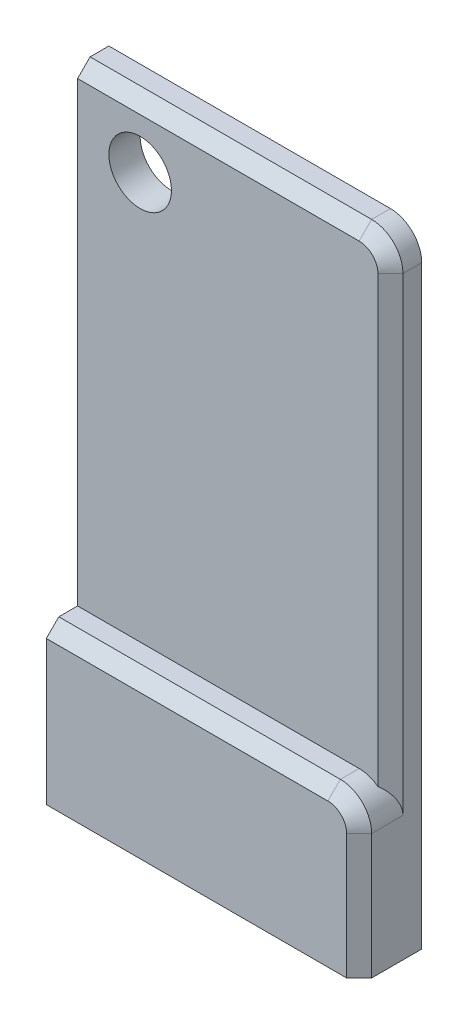
ISO-10303-21;
HEADER;
FILE_DESCRIPTION(('STEP AP214'),'2;1');
FILE_NAME('part.step','',(''),(''),'','','');
FILE_SCHEMA(('AUTOMOTIVE_DESIGN { 1 0 10303 214 1 1 1 1 }'));
ENDSEC;
DATA;
#1=APPLICATION_CONTEXT('core data for automotive mechanical design processes');
#2=APPLICATION_PROTOCOL_DEFINITION('international standard','automotive_design',2000,#1);
#3=PRODUCT_CONTEXT('',#1,'mechanical');
#4=PRODUCT('Part','Part','',(#3));
#5=PRODUCT_RELATED_PRODUCT_CATEGORY('part','',(#4));
#6=PRODUCT_DEFINITION_FORMATION('','',#4);
#7=PRODUCT_DEFINITION_CONTEXT('part definition',#1,'design');
#8=PRODUCT_DEFINITION('design','',#6,#7);
#9=PRODUCT_DEFINITION_SHAPE('','',#8);
#10=(LENGTH_UNIT() NAMED_UNIT(*) SI_UNIT(.MILLI.,.METRE.));
#11=(NAMED_UNIT(*) PLANE_ANGLE_UNIT() SI_UNIT($,.RADIAN.));
#12=(NAMED_UNIT(*) SI_UNIT($,.STERADIAN.) SOLID_ANGLE_UNIT());
#13=UNCERTAINTY_MEASURE_WITH_UNIT(LENGTH_MEASURE(1.E-05),#10,'distance_accuracy_value','');
#14=(GEOMETRIC_REPRESENTATION_CONTEXT(3) GLOBAL_UNCERTAINTY_ASSIGNED_CONTEXT((#13)) GLOBAL_UNIT_ASSIGNED_CONTEXT((#10,
#11,#12)) REPRESENTATION_CONTEXT('',''));
#15=CARTESIAN_POINT('',(0.,0.,0.));
#16=DIRECTION('',(0.,0.,1.));
#17=DIRECTION('',(1.,0.,0.));
#18=AXIS2_PLACEMENT_3D('',#15,#16,#17);
#19=CARTESIAN_POINT('',(0.,0.,0.));
#20=DIRECTION('',(0.,0.,1.));
#21=DIRECTION('',(1.,0.,0.));
#22=AXIS2_PLACEMENT_3D('',#19,#20,#21);
#23=PLANE('',#22);
#24=CARTESIAN_POINT('',(-100.000000000001,360.714285714286,0.));
#25=DIRECTION('',(0.,0.,1.));
#26=DIRECTION('',(1.,0.,0.));
#27=AXIS2_PLACEMENT_3D('',#24,#25,#26);
#28=CIRCLE('',#27,50.);
#29=CARTESIAN_POINT('',(-50.0000000000006,360.714285714286,0.));
#30=VERTEX_POINT('',#29);
#31=EDGE_CURVE('E336',#30,#30,#28,.T.);
#32=ORIENTED_EDGE('',*,*,#31,.T.);
#33=EDGE_LOOP('',(#32));
#34=FACE_BOUND('',#33,.T.);
#35=CARTESIAN_POINT('',(-100.000000000001,360.714285714286,0.));
#36=DIRECTION('',(0.,0.,1.));
#37=DIRECTION('',(1.,0.,0.));
#38=AXIS2_PLACEMENT_3D('',#35,#36,#37);
#39=CIRCLE('',#38,60.);
#40=CARTESIAN_POINT('',(-40.0000000000006,360.714285714286,0.));
#41=VERTEX_POINT('',#40);
#42=EDGE_CURVE('E249',#41,#41,#39,.T.);
#43=ORIENTED_EDGE('',*,*,#42,.F.);
#44=EDGE_LOOP('',(#43));
#45=FACE_BOUND('',#44,.T.);
#46=ADVANCED_FACE('F44',(#34,#45),#23,.F.);
#47=CARTESIAN_POINT('',(-200.000000000001,460.714285714286,50.));
#48=DIRECTION('',(1.,0.,0.));
#49=DIRECTION('',(0.,1.,0.));
#50=AXIS2_PLACEMENT_3D('',#47,#48,#49);
#51=PLANE('',#50);
#52=DIRECTION('',(0.,-0.707106781186546,0.707106781186549));
#53=VECTOR('',#52,1.);
#54=CARTESIAN_POINT('',(-200.000000000001,-316.35678209758,92.9289321881346));
#55=LINE('',#54,#53);
#56=CARTESIAN_POINT('',(-200.000000000001,-313.427849909445,90.));
#57=VERTEX_POINT('',#56);
#58=CARTESIAN_POINT('',(-200.000000000001,-299.285714285714,75.857864376269));
#59=VERTEX_POINT('',#58);
#60=EDGE_CURVE('E268',#57,#59,#55,.F.);
#61=ORIENTED_EDGE('',*,*,#60,.F.);
#62=DIRECTION('',(0.,-1.,0.));
#63=VECTOR('',#62,1.);
#64=CARTESIAN_POINT('',(-200.000000000001,0.,90.));
#65=LINE('',#64,#63);
#66=CARTESIAN_POINT('',(-200.000000000001,-539.285714285714,90.));
#67=VERTEX_POINT('',#66);
#68=EDGE_CURVE('E265',#57,#67,#65,.T.);
#69=ORIENTED_EDGE('',*,*,#68,.T.);
#70=DIRECTION('',(0.,0.,-1.));
#71=VECTOR('',#70,1.);
#72=CARTESIAN_POINT('',(-200.000000000001,-539.285714285714,50.));
#73=LINE('',#72,#71);
#74=CARTESIAN_POINT('',(-200.000000000001,-539.285714285714,100.));
#75=VERTEX_POINT('',#74);
#76=EDGE_CURVE('E385',#75,#67,#73,.T.);
#77=ORIENTED_EDGE('',*,*,#76,.F.);
#78=DIRECTION('',(0.,-1.,0.));
#79=VECTOR('',#78,1.);
#80=CARTESIAN_POINT('',(-200.000000000001,-539.285714285714,100.));
#81=LINE('',#80,#79);
#82=CARTESIAN_POINT('',(-200.000000000001,-309.285714285714,100.));
#83=VERTEX_POINT('',#82);
#84=EDGE_CURVE('E346',#83,#75,#81,.T.);
#85=ORIENTED_EDGE('',*,*,#84,.F.);
#86=DIRECTION('',(0.,-0.707106781186546,0.707106781186549));
#87=VECTOR('',#86,1.);
#88=CARTESIAN_POINT('',(-200.000000000001,-309.285714285714,100.));
#89=LINE('',#88,#87);
#90=CARTESIAN_POINT('',(-200.000000000001,-289.285714285714,80.));
#91=VERTEX_POINT('',#90);
#92=EDGE_CURVE('E436',#83,#91,#89,.F.);
#93=ORIENTED_EDGE('',*,*,#92,.T.);
#94=DIRECTION('',(0.,0.,-1.));
#95=VECTOR('',#94,1.);
#96=CARTESIAN_POINT('',(-200.000000000001,-289.285714285714,100.));
#97=LINE('',#96,#95);
#98=CARTESIAN_POINT('',(-200.000000000001,-289.285714285714,50.));
#99=VERTEX_POINT('',#98);
#100=EDGE_CURVE('E353',#91,#99,#97,.T.);
#101=ORIENTED_EDGE('',*,*,#100,.T.);
#102=DIRECTION('',(0.,-1.,0.));
#103=VECTOR('',#102,1.);
#104=CARTESIAN_POINT('',(-200.000000000001,460.714285714286,50.));
#105=LINE('',#104,#103);
#106=CARTESIAN_POINT('',(-200.000000000001,440.714285714286,50.));
#107=VERTEX_POINT('',#106);
#108=EDGE_CURVE('E361',#107,#99,#105,.T.);
#109=ORIENTED_EDGE('',*,*,#108,.F.);
#110=DIRECTION('',(0.,0.707106781186546,-0.707106781186549));
#111=VECTOR('',#110,1.);
#112=CARTESIAN_POINT('',(-200.000000000001,440.714285714286,50.));
#113=LINE('',#112,#111);
#114=CARTESIAN_POINT('',(-200.000000000001,460.714285714286,30.));
#115=VERTEX_POINT('',#114);
#116=EDGE_CURVE('E433',#107,#115,#113,.T.);
#117=ORIENTED_EDGE('',*,*,#116,.T.);
#118=DIRECTION('',(0.,0.,-1.));
#119=VECTOR('',#118,1.);
#120=CARTESIAN_POINT('',(-200.000000000001,460.714285714286,50.));
#121=LINE('',#120,#119);
#122=CARTESIAN_POINT('',(-200.000000000001,460.714285714286,0.));
#123=VERTEX_POINT('',#122);
#124=EDGE_CURVE('E364',#115,#123,#121,.T.);
#125=ORIENTED_EDGE('',*,*,#124,.T.);
#126=DIRECTION('',(0.,-1.,0.));
#127=VECTOR('',#126,1.);
#128=CARTESIAN_POINT('',(-200.000000000001,460.714285714286,0.));
#129=LINE('',#128,#127);
#130=CARTESIAN_POINT('',(-200.000000000001,450.714285714286,0.));
#131=VERTEX_POINT('',#130);
#132=EDGE_CURVE('E360',#123,#131,#129,.T.);
#133=ORIENTED_EDGE('',*,*,#132,.T.);
#134=DIRECTION('',(0.,0.,-1.));
#135=VECTOR('',#134,1.);
#136=CARTESIAN_POINT('',(-200.000000000001,450.714285714286,50.));
#137=LINE('',#136,#135);
#138=CARTESIAN_POINT('',(-200.000000000001,450.714285714286,25.857864376269));
#139=VERTEX_POINT('',#138);
#140=EDGE_CURVE('E298',#139,#131,#137,.T.);
#141=ORIENTED_EDGE('',*,*,#140,.F.);
#142=DIRECTION('',(0.,0.707106781186546,-0.707106781186549));
#143=VECTOR('',#142,1.);
#144=CARTESIAN_POINT('',(-200.000000000001,433.64321790242,42.9289321881346));
#145=LINE('',#144,#143);
#146=CARTESIAN_POINT('',(-200.000000000001,436.572150090555,40.));
#147=VERTEX_POINT('',#146);
#148=EDGE_CURVE('E312',#147,#139,#145,.T.);
#149=ORIENTED_EDGE('',*,*,#148,.F.);
#150=DIRECTION('',(0.,-1.,0.));
#151=VECTOR('',#150,1.);
#152=CARTESIAN_POINT('',(-200.000000000001,460.714285714286,40.));
#153=LINE('',#152,#151);
#154=CARTESIAN_POINT('',(-200.000000000001,-299.285714285714,40.));
#155=VERTEX_POINT('',#154);
#156=EDGE_CURVE('E316',#147,#155,#153,.T.);
#157=ORIENTED_EDGE('',*,*,#156,.T.);
#158=DIRECTION('',(0.,0.,-1.));
#159=VECTOR('',#158,1.);
#160=CARTESIAN_POINT('',(-200.000000000001,-299.285714285714,50.));
#161=LINE('',#160,#159);
#162=EDGE_CURVE('E306',#59,#155,#161,.T.);
#163=ORIENTED_EDGE('',*,*,#162,.F.);
#164=EDGE_LOOP('',(#61,#69,#77,#85,#93,#101,#109,#117,#125,#133,#141,#149,#157,#163));
#165=FACE_BOUND('',#164,.T.);
#166=ADVANCED_FACE('F479',(#165),#51,.F.);
#167=CARTESIAN_POINT('',(-200.000000000001,-539.285714285714,50.));
#168=DIRECTION('',(0.,1.,0.));
#169=DIRECTION('',(-1.,0.,0.));
#170=AXIS2_PLACEMENT_3D('',#167,#168,#169);
#171=PLANE('',#170);
#172=DIRECTION('',(0.707106781186546,0.,-0.707106781186549));
#173=VECTOR('',#172,1.);
#174=CARTESIAN_POINT('',(272.928932188134,-539.285714285714,92.9289321881346));
#175=LINE('',#174,#173);
#176=CARTESIAN_POINT('',(289.999999999999,-539.285714285714,75.857864376269));
#177=VERTEX_POINT('',#176);
#178=CARTESIAN_POINT('',(275.857864376268,-539.285714285714,90.));
#179=VERTEX_POINT('',#178);
#180=EDGE_CURVE('E299',#177,#179,#175,.F.);
#181=ORIENTED_EDGE('',*,*,#180,.F.);
#182=DIRECTION('',(0.,0.,-1.));
#183=VECTOR('',#182,1.);
#184=CARTESIAN_POINT('',(289.999999999999,-539.285714285714,50.));
#185=LINE('',#184,#183);
#186=CARTESIAN_POINT('',(289.999999999999,-539.285714285714,0.));
#187=VERTEX_POINT('',#186);
#188=EDGE_CURVE('E293',#177,#187,#185,.T.);
#189=ORIENTED_EDGE('',*,*,#188,.T.);
#190=DIRECTION('',(1.,0.,0.));
#191=VECTOR('',#190,1.);
#192=CARTESIAN_POINT('',(-200.000000000001,-539.285714285714,0.));
#193=LINE('',#192,#191);
#194=CARTESIAN_POINT('',(299.999999999999,-539.285714285714,0.));
#195=VERTEX_POINT('',#194);
#196=EDGE_CURVE('E369',#187,#195,#193,.T.);
#197=ORIENTED_EDGE('',*,*,#196,.T.);
#198=DIRECTION('',(0.,0.,-1.));
#199=VECTOR('',#198,1.);
#200=CARTESIAN_POINT('',(299.999999999999,-539.285714285714,50.));
#201=LINE('',#200,#199);
#202=CARTESIAN_POINT('',(299.999999999999,-539.285714285714,80.));
#203=VERTEX_POINT('',#202);
#204=EDGE_CURVE('E381',#203,#195,#201,.T.);
#205=ORIENTED_EDGE('',*,*,#204,.F.);
#206=DIRECTION('',(0.707106781186546,0.,-0.707106781186549));
#207=VECTOR('',#206,1.);
#208=CARTESIAN_POINT('',(279.999999999999,-539.285714285714,100.));
#209=LINE('',#208,#207);
#210=CARTESIAN_POINT('',(279.999999999999,-539.285714285714,100.));
#211=VERTEX_POINT('',#210);
#212=EDGE_CURVE('E427',#203,#211,#209,.F.);
#213=ORIENTED_EDGE('',*,*,#212,.T.);
#214=DIRECTION('',(1.,0.,0.));
#215=VECTOR('',#214,1.);
#216=CARTESIAN_POINT('',(-200.000000000001,-539.285714285714,100.));
#217=LINE('',#216,#215);
#218=EDGE_CURVE('E349',#75,#211,#217,.T.);
#219=ORIENTED_EDGE('',*,*,#218,.F.);
#220=ORIENTED_EDGE('',*,*,#76,.T.);
#221=DIRECTION('',(1.,0.,0.));
#222=VECTOR('',#221,1.);
#223=CARTESIAN_POINT('',(-1.19745483370285E-13,-539.285714285714,90.));
#224=LINE('',#223,#222);
#225=EDGE_CURVE('E302',#67,#179,#224,.T.);
#226=ORIENTED_EDGE('',*,*,#225,.T.);
#227=EDGE_LOOP('',(#181,#189,#197,#205,#213,#219,#220,#226));
#228=FACE_BOUND('',#227,.T.);
#229=ADVANCED_FACE('F485',(#228),#171,.F.);
#230=CARTESIAN_POINT('',(299.999999999999,460.714285714286,50.));
#231=DIRECTION('',(-1.,0.,0.));
#232=DIRECTION('',(0.,0.,1.));
#233=AXIS2_PLACEMENT_3D('',#230,#231,#232);
#234=PLANE('',#233);
#235=DIRECTION('',(0.,0.,-1.));
#236=VECTOR('',#235,1.);
#237=CARTESIAN_POINT('',(299.999999999999,-339.285714285714,50.));
#238=LINE('',#237,#236);
#239=CARTESIAN_POINT('',(299.999999999999,-339.285714285714,30.));
#240=VERTEX_POINT('',#239);
#241=CARTESIAN_POINT('',(299.999999999999,-339.285714285714,80.));
#242=VERTEX_POINT('',#241);
#243=EDGE_CURVE('E396',#240,#242,#238,.F.);
#244=ORIENTED_EDGE('',*,*,#243,.T.);
#245=DIRECTION('',(0.,-1.,0.));
#246=VECTOR('',#245,1.);
#247=CARTESIAN_POINT('',(299.999999999999,460.714285714286,80.));
#248=LINE('',#247,#246);
#249=EDGE_CURVE('E424',#242,#203,#248,.T.);
#250=ORIENTED_EDGE('',*,*,#249,.T.);
#251=ORIENTED_EDGE('',*,*,#204,.T.);
#252=DIRECTION('',(0.,1.,0.));
#253=VECTOR('',#252,1.);
#254=CARTESIAN_POINT('',(299.999999999999,460.714285714286,0.));
#255=LINE('',#254,#253);
#256=CARTESIAN_POINT('',(299.999999999999,410.714285714286,0.));
#257=VERTEX_POINT('',#256);
#258=EDGE_CURVE('E372',#195,#257,#255,.T.);
#259=ORIENTED_EDGE('',*,*,#258,.T.);
#260=DIRECTION('',(0.,0.,-1.));
#261=VECTOR('',#260,1.);
#262=CARTESIAN_POINT('',(299.999999999999,410.714285714286,50.));
#263=LINE('',#262,#261);
#264=CARTESIAN_POINT('',(299.999999999999,410.714285714286,30.));
#265=VERTEX_POINT('',#264);
#266=EDGE_CURVE('E392',#257,#265,#263,.F.);
#267=ORIENTED_EDGE('',*,*,#266,.T.);
#268=DIRECTION('',(0.,-1.,0.));
#269=VECTOR('',#268,1.);
#270=CARTESIAN_POINT('',(299.999999999999,-339.285714285714,30.));
#271=LINE('',#270,#269);
#272=EDGE_CURVE('E420',#265,#240,#271,.T.);
#273=ORIENTED_EDGE('',*,*,#272,.T.);
#274=EDGE_LOOP('',(#244,#250,#251,#259,#267,#273));
#275=FACE_BOUND('',#274,.T.);
#276=ADVANCED_FACE('F493',(#275),#234,.F.);
#277=CARTESIAN_POINT('',(-200.000000000001,460.714285714286,50.));
#278=DIRECTION('',(0.,-1.,0.));
#279=DIRECTION('',(0.,0.,-1.));
#280=AXIS2_PLACEMENT_3D('',#277,#278,#279);
#281=PLANE('',#280);
#282=ORIENTED_EDGE('',*,*,#124,.F.);
#283=DIRECTION('',(1.,0.,0.));
#284=VECTOR('',#283,1.);
#285=CARTESIAN_POINT('',(249.999999999999,460.714285714286,30.));
#286=LINE('',#285,#284);
#287=CARTESIAN_POINT('',(249.999999999999,460.714285714286,30.));
#288=VERTEX_POINT('',#287);
#289=EDGE_CURVE('E55',#115,#288,#286,.T.);
#290=ORIENTED_EDGE('',*,*,#289,.T.);
#291=DIRECTION('',(0.,0.,-1.));
#292=VECTOR('',#291,1.);
#293=CARTESIAN_POINT('',(249.999999999999,460.714285714286,50.));
#294=LINE('',#293,#292);
#295=CARTESIAN_POINT('',(249.999999999999,460.714285714286,0.));
#296=VERTEX_POINT('',#295);
#297=EDGE_CURVE('E400',#288,#296,#294,.T.);
#298=ORIENTED_EDGE('',*,*,#297,.T.);
#299=DIRECTION('',(-1.,0.,0.));
#300=VECTOR('',#299,1.);
#301=CARTESIAN_POINT('',(-200.000000000001,460.714285714286,0.));
#302=LINE('',#301,#300);
#303=EDGE_CURVE('E365',#296,#123,#302,.T.);
#304=ORIENTED_EDGE('',*,*,#303,.T.);
#305=EDGE_LOOP('',(#282,#290,#298,#304));
#306=FACE_BOUND('',#305,.T.);
#307=ADVANCED_FACE('F552',(#306),#281,.F.);
#308=CARTESIAN_POINT('',(0.,0.,50.));
#309=DIRECTION('',(0.,0.,1.));
#310=DIRECTION('',(1.,0.,0.));
#311=AXIS2_PLACEMENT_3D('',#308,#309,#310);
#312=PLANE('',#311);
#313=CARTESIAN_POINT('',(-100.000000000001,360.714285714286,50.));
#314=DIRECTION('',(0.,0.,1.));
#315=DIRECTION('',(1.,0.,0.));
#316=AXIS2_PLACEMENT_3D('',#313,#314,#315);
#317=CIRCLE('',#316,50.);
#318=CARTESIAN_POINT('',(-50.0000000000006,360.714285714286,50.));
#319=VERTEX_POINT('',#318);
#320=EDGE_CURVE('E341',#319,#319,#317,.T.);
#321=ORIENTED_EDGE('',*,*,#320,.F.);
#322=EDGE_LOOP('',(#321));
#323=FACE_BOUND('',#322,.T.);
#324=CARTESIAN_POINT('',(249.999999999999,-339.285714285714,50.));
#325=DIRECTION('',(0.,0.,1.));
#326=DIRECTION('',(1.,0.,0.));
#327=AXIS2_PLACEMENT_3D('',#324,#325,#326);
#328=CIRCLE('',#327,50.);
#329=CARTESIAN_POINT('',(249.999999999999,-289.285714285714,50.));
#330=VERTEX_POINT('',#329);
#331=CARTESIAN_POINT('',(279.999999999999,-299.285714285714,50.));
#332=VERTEX_POINT('',#331);
#333=EDGE_CURVE('E406',#330,#332,#328,.F.);
#334=ORIENTED_EDGE('',*,*,#333,.T.);
#335=DIRECTION('',(0.,1.,0.));
#336=VECTOR('',#335,1.);
#337=CARTESIAN_POINT('',(279.999999999999,410.714285714286,50.));
#338=LINE('',#337,#336);
#339=CARTESIAN_POINT('',(279.999999999999,410.714285714286,50.));
#340=VERTEX_POINT('',#339);
#341=EDGE_CURVE('E448',#332,#340,#338,.T.);
#342=ORIENTED_EDGE('',*,*,#341,.T.);
#343=CARTESIAN_POINT('',(249.999999999999,410.714285714286,50.));
#344=DIRECTION('',(0.,0.,1.));
#345=DIRECTION('',(1.,0.,0.));
#346=AXIS2_PLACEMENT_3D('',#343,#344,#345);
#347=CIRCLE('',#346,30.0000000000001);
#348=CARTESIAN_POINT('',(249.999999999999,440.714285714286,50.));
#349=VERTEX_POINT('',#348);
#350=EDGE_CURVE('E445',#340,#349,#347,.T.);
#351=ORIENTED_EDGE('',*,*,#350,.T.);
#352=DIRECTION('',(-1.,0.,0.));
#353=VECTOR('',#352,1.);
#354=CARTESIAN_POINT('',(-200.000000000001,440.714285714286,50.));
#355=LINE('',#354,#353);
#356=EDGE_CURVE('E442',#349,#107,#355,.T.);
#357=ORIENTED_EDGE('',*,*,#356,.T.);
#358=ORIENTED_EDGE('',*,*,#108,.T.);
#359=DIRECTION('',(-1.,0.,0.));
#360=VECTOR('',#359,1.);
#361=CARTESIAN_POINT('',(-200.000000000001,-289.285714285714,50.));
#362=LINE('',#361,#360);
#363=EDGE_CURVE('E340',#330,#99,#362,.T.);
#364=ORIENTED_EDGE('',*,*,#363,.F.);
#365=EDGE_LOOP('',(#334,#342,#351,#357,#358,#364));
#366=FACE_BOUND('',#365,.T.);
#367=ADVANCED_FACE('F522',(#323,#366),#312,.T.);
#368=CARTESIAN_POINT('',(249.999999999999,410.714285714286,0.));
#369=DIRECTION('',(0.,0.,1.));
#370=DIRECTION('',(1.,0.,0.));
#371=AXIS2_PLACEMENT_3D('',#368,#369,#370);
#372=CIRCLE('',#371,40.);
#373=CARTESIAN_POINT('',(249.999999999999,450.714285714286,0.));
#374=VERTEX_POINT('',#373);
#375=CARTESIAN_POINT('',(289.999999999999,410.714285714286,0.));
#376=VERTEX_POINT('',#375);
#377=EDGE_CURVE('E244',#374,#376,#372,.F.);
#378=ORIENTED_EDGE('',*,*,#377,.F.);
#379=DIRECTION('',(-1.,0.,0.));
#380=VECTOR('',#379,1.);
#381=CARTESIAN_POINT('',(-200.000000000001,450.714285714286,0.));
#382=LINE('',#381,#380);
#383=EDGE_CURVE('E320',#374,#131,#382,.T.);
#384=ORIENTED_EDGE('',*,*,#383,.T.);
#385=ORIENTED_EDGE('',*,*,#132,.F.);
#386=ORIENTED_EDGE('',*,*,#303,.F.);
#387=CARTESIAN_POINT('',(249.999999999999,410.714285714286,0.));
#388=DIRECTION('',(0.,0.,1.));
#389=DIRECTION('',(1.,0.,0.));
#390=AXIS2_PLACEMENT_3D('',#387,#388,#389);
#391=CIRCLE('',#390,50.);
#392=EDGE_CURVE('E403',#296,#257,#391,.F.);
#393=ORIENTED_EDGE('',*,*,#392,.T.);
#394=ORIENTED_EDGE('',*,*,#258,.F.);
#395=ORIENTED_EDGE('',*,*,#196,.F.);
#396=DIRECTION('',(0.,1.,0.));
#397=VECTOR('',#396,1.);
#398=CARTESIAN_POINT('',(289.999999999999,460.714285714286,0.));
#399=LINE('',#398,#397);
#400=EDGE_CURVE('E315',#187,#376,#399,.T.);
#401=ORIENTED_EDGE('',*,*,#400,.T.);
#402=EDGE_LOOP('',(#378,#384,#385,#386,#393,#394,#395,#401));
#403=FACE_BOUND('',#402,.T.);
#404=ADVANCED_FACE('F498',(#403),#23,.F.);
#405=CARTESIAN_POINT('',(-200.000000000001,-289.285714285714,100.));
#406=DIRECTION('',(0.,-1.,0.));
#407=DIRECTION('',(0.,0.,-1.));
#408=AXIS2_PLACEMENT_3D('',#405,#406,#407);
#409=PLANE('',#408);
#410=ORIENTED_EDGE('',*,*,#100,.F.);
#411=DIRECTION('',(1.,0.,0.));
#412=VECTOR('',#411,1.);
#413=CARTESIAN_POINT('',(-200.000000000001,-289.285714285714,80.));
#414=LINE('',#413,#412);
#415=CARTESIAN_POINT('',(249.999999999999,-289.285714285714,80.));
#416=VERTEX_POINT('',#415);
#417=EDGE_CURVE('E439',#91,#416,#414,.T.);
#418=ORIENTED_EDGE('',*,*,#417,.T.);
#419=DIRECTION('',(0.,0.,-1.));
#420=VECTOR('',#419,1.);
#421=CARTESIAN_POINT('',(249.999999999999,-289.285714285714,100.));
#422=LINE('',#421,#420);
#423=EDGE_CURVE('E389',#416,#330,#422,.T.);
#424=ORIENTED_EDGE('',*,*,#423,.T.);
#425=ORIENTED_EDGE('',*,*,#363,.T.);
#426=EDGE_LOOP('',(#410,#418,#424,#425));
#427=FACE_BOUND('',#426,.T.);
#428=ADVANCED_FACE('F525',(#427),#409,.F.);
#429=CARTESIAN_POINT('',(0.,0.,100.));
#430=DIRECTION('',(0.,0.,-1.));
#431=DIRECTION('',(-1.,0.,0.));
#432=AXIS2_PLACEMENT_3D('',#429,#430,#431);
#433=PLANE('',#432);
#434=ORIENTED_EDGE('',*,*,#218,.T.);
#435=DIRECTION('',(0.,1.,0.));
#436=VECTOR('',#435,1.);
#437=CARTESIAN_POINT('',(279.999999999999,0.,100.));
#438=LINE('',#437,#436);
#439=CARTESIAN_POINT('',(279.999999999999,-339.285714285714,100.));
#440=VERTEX_POINT('',#439);
#441=EDGE_CURVE('E416',#211,#440,#438,.T.);
#442=ORIENTED_EDGE('',*,*,#441,.T.);
#443=CARTESIAN_POINT('',(249.999999999999,-339.285714285714,100.));
#444=DIRECTION('',(0.,0.,-1.));
#445=DIRECTION('',(-1.,0.,0.));
#446=AXIS2_PLACEMENT_3D('',#443,#444,#445);
#447=CIRCLE('',#446,30.0000000000001);
#448=CARTESIAN_POINT('',(249.999999999999,-309.285714285714,100.));
#449=VERTEX_POINT('',#448);
#450=EDGE_CURVE('E413',#440,#449,#447,.F.);
#451=ORIENTED_EDGE('',*,*,#450,.T.);
#452=DIRECTION('',(-1.,0.,0.));
#453=VECTOR('',#452,1.);
#454=CARTESIAN_POINT('',(0.,-309.285714285714,100.));
#455=LINE('',#454,#453);
#456=EDGE_CURVE('E410',#449,#83,#455,.T.);
#457=ORIENTED_EDGE('',*,*,#456,.T.);
#458=ORIENTED_EDGE('',*,*,#84,.T.);
#459=EDGE_LOOP('',(#434,#442,#451,#457,#458));
#460=FACE_BOUND('',#459,.T.);
#461=ADVANCED_FACE('F475',(#460),#433,.F.);
#462=CARTESIAN_POINT('',(-100.000000000001,360.714285714286,0.));
#463=DIRECTION('',(0.,0.,1.));
#464=DIRECTION('',(1.,0.,0.));
#465=AXIS2_PLACEMENT_3D('',#462,#463,#464);
#466=CYLINDRICAL_SURFACE('',#465,50.);
#467=ORIENTED_EDGE('',*,*,#31,.F.);
#468=EDGE_LOOP('',(#467));
#469=FACE_BOUND('',#468,.T.);
#470=ORIENTED_EDGE('',*,*,#320,.T.);
#471=EDGE_LOOP('',(#470));
#472=FACE_BOUND('',#471,.T.);
#473=ADVANCED_FACE('F561',(#469,#472),#466,.F.);
#474=CARTESIAN_POINT('',(249.999999999999,-339.285714285714,100.));
#475=DIRECTION('',(0.,0.,-1.));
#476=DIRECTION('',(-1.,0.,0.));
#477=AXIS2_PLACEMENT_3D('',#474,#475,#476);
#478=CYLINDRICAL_SURFACE('',#477,50.);
#479=ORIENTED_EDGE('',*,*,#423,.F.);
#480=CARTESIAN_POINT('',(249.999999999999,-339.285714285714,80.));
#481=DIRECTION('',(0.,0.,-1.));
#482=DIRECTION('',(-1.,0.,0.));
#483=AXIS2_PLACEMENT_3D('',#480,#481,#482);
#484=CIRCLE('',#483,50.);
#485=EDGE_CURVE('E430',#416,#242,#484,.T.);
#486=ORIENTED_EDGE('',*,*,#485,.T.);
#487=ORIENTED_EDGE('',*,*,#243,.F.);
#488=CARTESIAN_POINT('',(249.999999999999,-339.285714285714,80.0000000000003));
#489=DIRECTION('',(0.707106781186549,0.,0.707106781186546));
#490=DIRECTION('',(0.707106781186546,0.,-0.707106781186549));
#491=AXIS2_PLACEMENT_3D('',#488,#489,#490);
#492=ELLIPSE('',#491,70.7106781186549,50.);
#493=EDGE_CURVE('E11',#240,#332,#492,.T.);
#494=ORIENTED_EDGE('',*,*,#493,.T.);
#495=ORIENTED_EDGE('',*,*,#333,.F.);
#496=EDGE_LOOP('',(#479,#486,#487,#494,#495));
#497=FACE_BOUND('',#496,.T.);
#498=ADVANCED_FACE('F519',(#497),#478,.T.);
#499=CARTESIAN_POINT('',(249.999999999999,410.714285714286,50.));
#500=DIRECTION('',(0.,0.,-1.));
#501=DIRECTION('',(-1.,0.,0.));
#502=AXIS2_PLACEMENT_3D('',#499,#500,#501);
#503=CYLINDRICAL_SURFACE('',#502,50.);
#504=ORIENTED_EDGE('',*,*,#297,.F.);
#505=CARTESIAN_POINT('',(249.999999999999,410.714285714286,30.));
#506=DIRECTION('',(0.,0.,1.));
#507=DIRECTION('',(1.,0.,0.));
#508=AXIS2_PLACEMENT_3D('',#505,#506,#507);
#509=CIRCLE('',#508,50.);
#510=EDGE_CURVE('E452',#288,#265,#509,.F.);
#511=ORIENTED_EDGE('',*,*,#510,.T.);
#512=ORIENTED_EDGE('',*,*,#266,.F.);
#513=ORIENTED_EDGE('',*,*,#392,.F.);
#514=EDGE_LOOP('',(#504,#511,#512,#513));
#515=FACE_BOUND('',#514,.T.);
#516=ADVANCED_FACE('F504',(#515),#503,.T.);
#517=CARTESIAN_POINT('',(0.,-309.285714285714,100.));
#518=DIRECTION('',(0.,-0.707106781186549,-0.707106781186546));
#519=DIRECTION('',(-1.,0.,0.));
#520=AXIS2_PLACEMENT_3D('',#517,#518,#519);
#521=PLANE('',#520);
#522=ORIENTED_EDGE('',*,*,#92,.F.);
#523=ORIENTED_EDGE('',*,*,#456,.F.);
#524=DIRECTION('',(0.,-0.707106781186546,0.707106781186549));
#525=VECTOR('',#524,1.);
#526=CARTESIAN_POINT('',(249.999999999999,-289.285714285714,80.));
#527=LINE('',#526,#525);
#528=EDGE_CURVE('E345',#416,#449,#527,.T.);
#529=ORIENTED_EDGE('',*,*,#528,.F.);
#530=ORIENTED_EDGE('',*,*,#417,.F.);
#531=EDGE_LOOP('',(#522,#523,#529,#530));
#532=FACE_BOUND('',#531,.T.);
#533=ADVANCED_FACE('F472',(#532),#521,.F.);
#534=CARTESIAN_POINT('',(249.999999999999,-339.285714285714,100.));
#535=DIRECTION('',(0.,0.,-1.));
#536=DIRECTION('',(-1.,0.,0.));
#537=AXIS2_PLACEMENT_3D('',#534,#535,#536);
#538=CONICAL_SURFACE('',#537,30.0000000000001,0.785398163397446);
#539=ORIENTED_EDGE('',*,*,#528,.T.);
#540=ORIENTED_EDGE('',*,*,#450,.F.);
#541=DIRECTION('',(-0.707106781186546,0.,0.707106781186549));
#542=VECTOR('',#541,1.);
#543=CARTESIAN_POINT('',(299.999999999999,-339.285714285714,80.));
#544=LINE('',#543,#542);
#545=EDGE_CURVE('E457',#242,#440,#544,.T.);
#546=ORIENTED_EDGE('',*,*,#545,.F.);
#547=ORIENTED_EDGE('',*,*,#485,.F.);
#548=EDGE_LOOP('',(#539,#540,#546,#547));
#549=FACE_BOUND('',#548,.T.);
#550=ADVANCED_FACE('F466',(#549),#538,.T.);
#551=CARTESIAN_POINT('',(279.999999999999,0.,100.));
#552=DIRECTION('',(-0.707106781186549,0.,-0.707106781186546));
#553=DIRECTION('',(0.,1.,0.));
#554=AXIS2_PLACEMENT_3D('',#551,#552,#553);
#555=PLANE('',#554);
#556=ORIENTED_EDGE('',*,*,#212,.F.);
#557=ORIENTED_EDGE('',*,*,#249,.F.);
#558=ORIENTED_EDGE('',*,*,#545,.T.);
#559=ORIENTED_EDGE('',*,*,#441,.F.);
#560=EDGE_LOOP('',(#556,#557,#558,#559));
#561=FACE_BOUND('',#560,.T.);
#562=ADVANCED_FACE('F490',(#561),#555,.F.);
#563=CARTESIAN_POINT('',(0.,440.714285714286,50.));
#564=DIRECTION('',(0.,0.707106781186549,0.707106781186546));
#565=DIRECTION('',(1.,0.,0.));
#566=AXIS2_PLACEMENT_3D('',#563,#564,#565);
#567=PLANE('',#566);
#568=ORIENTED_EDGE('',*,*,#116,.F.);
#569=ORIENTED_EDGE('',*,*,#356,.F.);
#570=DIRECTION('',(0.,-0.707106781186546,0.707106781186549));
#571=VECTOR('',#570,1.);
#572=CARTESIAN_POINT('',(249.999999999999,460.714285714286,30.));
#573=LINE('',#572,#571);
#574=EDGE_CURVE('E49',#288,#349,#573,.T.);
#575=ORIENTED_EDGE('',*,*,#574,.F.);
#576=ORIENTED_EDGE('',*,*,#289,.F.);
#577=EDGE_LOOP('',(#568,#569,#575,#576));
#578=FACE_BOUND('',#577,.T.);
#579=ADVANCED_FACE('F47',(#578),#567,.T.);
#580=CARTESIAN_POINT('',(249.999999999999,410.714285714286,50.));
#581=DIRECTION('',(0.,0.,-1.));
#582=DIRECTION('',(-1.,0.,0.));
#583=AXIS2_PLACEMENT_3D('',#580,#581,#582);
#584=CONICAL_SURFACE('',#583,30.0000000000001,0.785398163397446);
#585=ORIENTED_EDGE('',*,*,#574,.T.);
#586=ORIENTED_EDGE('',*,*,#350,.F.);
#587=DIRECTION('',(-0.707106781186546,0.,0.707106781186549));
#588=VECTOR('',#587,1.);
#589=CARTESIAN_POINT('',(299.999999999999,410.714285714286,30.));
#590=LINE('',#589,#588);
#591=EDGE_CURVE('E230',#265,#340,#590,.T.);
#592=ORIENTED_EDGE('',*,*,#591,.F.);
#593=ORIENTED_EDGE('',*,*,#510,.F.);
#594=EDGE_LOOP('',(#585,#586,#592,#593));
#595=FACE_BOUND('',#594,.T.);
#596=ADVANCED_FACE('F510',(#595),#584,.T.);
#597=CARTESIAN_POINT('',(279.999999999999,0.,50.));
#598=DIRECTION('',(0.707106781186549,0.,0.707106781186546));
#599=DIRECTION('',(0.,-1.,0.));
#600=AXIS2_PLACEMENT_3D('',#597,#598,#599);
#601=PLANE('',#600);
#602=ORIENTED_EDGE('',*,*,#493,.F.);
#603=ORIENTED_EDGE('',*,*,#272,.F.);
#604=ORIENTED_EDGE('',*,*,#591,.T.);
#605=ORIENTED_EDGE('',*,*,#341,.F.);
#606=EDGE_LOOP('',(#602,#603,#604,#605));
#607=FACE_BOUND('',#606,.T.);
#608=ADVANCED_FACE('F515',(#607),#601,.T.);
#609=CARTESIAN_POINT('',(289.999999999999,460.714285714286,50.));
#610=DIRECTION('',(-1.,0.,0.));
#611=DIRECTION('',(0.,0.,1.));
#612=AXIS2_PLACEMENT_3D('',#609,#610,#611);
#613=PLANE('',#612);
#614=DIRECTION('',(0.,0.,1.));
#615=VECTOR('',#614,1.);
#616=CARTESIAN_POINT('',(289.999999999999,-339.285714285714,50.));
#617=LINE('',#616,#615);
#618=CARTESIAN_POINT('',(289.999999999999,-339.285714285714,25.857864376269));
#619=VERTEX_POINT('',#618);
#620=CARTESIAN_POINT('',(289.999999999999,-339.285714285714,75.857864376269));
#621=VERTEX_POINT('',#620);
#622=EDGE_CURVE('E202',#619,#621,#617,.T.);
#623=ORIENTED_EDGE('',*,*,#622,.F.);
#624=DIRECTION('',(0.,-1.,0.));
#625=VECTOR('',#624,1.);
#626=CARTESIAN_POINT('',(289.999999999999,0.,25.857864376269));
#627=LINE('',#626,#625);
#628=CARTESIAN_POINT('',(289.999999999999,410.714285714286,25.857864376269));
#629=VERTEX_POINT('',#628);
#630=EDGE_CURVE('E205',#629,#619,#627,.T.);
#631=ORIENTED_EDGE('',*,*,#630,.F.);
#632=DIRECTION('',(0.,0.,1.));
#633=VECTOR('',#632,1.);
#634=CARTESIAN_POINT('',(289.999999999999,410.714285714286,50.));
#635=LINE('',#634,#633);
#636=EDGE_CURVE('E63',#376,#629,#635,.T.);
#637=ORIENTED_EDGE('',*,*,#636,.F.);
#638=ORIENTED_EDGE('',*,*,#400,.F.);
#639=ORIENTED_EDGE('',*,*,#188,.F.);
#640=DIRECTION('',(0.,1.,0.));
#641=VECTOR('',#640,1.);
#642=CARTESIAN_POINT('',(289.999999999999,0.,75.857864376269));
#643=LINE('',#642,#641);
#644=EDGE_CURVE('E208',#621,#177,#643,.F.);
#645=ORIENTED_EDGE('',*,*,#644,.F.);
#646=EDGE_LOOP('',(#623,#631,#637,#638,#639,#645));
#647=FACE_BOUND('',#646,.T.);
#648=ADVANCED_FACE('F204',(#647),#613,.T.);
#649=CARTESIAN_POINT('',(-200.000000000001,450.714285714286,50.));
#650=DIRECTION('',(0.,-1.,0.));
#651=DIRECTION('',(0.,0.,-1.));
#652=AXIS2_PLACEMENT_3D('',#649,#650,#651);
#653=PLANE('',#652);
#654=ORIENTED_EDGE('',*,*,#140,.T.);
#655=ORIENTED_EDGE('',*,*,#383,.F.);
#656=DIRECTION('',(0.,0.,-1.));
#657=VECTOR('',#656,1.);
#658=CARTESIAN_POINT('',(249.999999999999,450.714285714286,50.));
#659=LINE('',#658,#657);
#660=CARTESIAN_POINT('',(249.999999999999,450.714285714286,25.8578643762691));
#661=VERTEX_POINT('',#660);
#662=EDGE_CURVE('E214',#661,#374,#659,.T.);
#663=ORIENTED_EDGE('',*,*,#662,.F.);
#664=DIRECTION('',(1.,0.,0.));
#665=VECTOR('',#664,1.);
#666=CARTESIAN_POINT('',(0.,450.714285714286,25.857864376269));
#667=LINE('',#666,#665);
#668=EDGE_CURVE('E231',#139,#661,#667,.T.);
#669=ORIENTED_EDGE('',*,*,#668,.F.);
#670=EDGE_LOOP('',(#654,#655,#663,#669));
#671=FACE_BOUND('',#670,.T.);
#672=ADVANCED_FACE('F608',(#671),#653,.T.);
#673=CARTESIAN_POINT('',(0.,0.,40.));
#674=DIRECTION('',(0.,0.,1.));
#675=DIRECTION('',(1.,0.,0.));
#676=AXIS2_PLACEMENT_3D('',#673,#674,#675);
#677=PLANE('',#676);
#678=CARTESIAN_POINT('',(-100.000000000001,360.714285714286,40.));
#679=DIRECTION('',(0.,0.,1.));
#680=DIRECTION('',(1.,0.,0.));
#681=AXIS2_PLACEMENT_3D('',#678,#679,#680);
#682=CIRCLE('',#681,60.);
#683=CARTESIAN_POINT('',(-40.0000000000006,360.714285714286,40.));
#684=VERTEX_POINT('',#683);
#685=EDGE_CURVE('E245',#684,#684,#682,.T.);
#686=ORIENTED_EDGE('',*,*,#685,.T.);
#687=EDGE_LOOP('',(#686));
#688=FACE_BOUND('',#687,.T.);
#689=CARTESIAN_POINT('',(249.999999999999,-339.285714285714,40.));
#690=DIRECTION('',(0.,0.,1.));
#691=DIRECTION('',(1.,0.,0.));
#692=AXIS2_PLACEMENT_3D('',#689,#690,#691);
#693=CIRCLE('',#692,40.);
#694=CARTESIAN_POINT('',(249.999999999999,-299.285714285714,40.));
#695=VERTEX_POINT('',#694);
#696=CARTESIAN_POINT('',(275.857864376268,-308.767345228727,40.));
#697=VERTEX_POINT('',#696);
#698=EDGE_CURVE('E227',#695,#697,#693,.F.);
#699=ORIENTED_EDGE('',*,*,#698,.F.);
#700=DIRECTION('',(-1.,0.,0.));
#701=VECTOR('',#700,1.);
#702=CARTESIAN_POINT('',(-200.000000000001,-299.285714285714,40.));
#703=LINE('',#702,#701);
#704=EDGE_CURVE('E261',#695,#155,#703,.T.);
#705=ORIENTED_EDGE('',*,*,#704,.T.);
#706=ORIENTED_EDGE('',*,*,#156,.F.);
#707=DIRECTION('',(-1.,0.,0.));
#708=VECTOR('',#707,1.);
#709=CARTESIAN_POINT('',(0.,436.572150090555,40.));
#710=LINE('',#709,#708);
#711=CARTESIAN_POINT('',(249.999999999999,436.572150090555,40.));
#712=VERTEX_POINT('',#711);
#713=EDGE_CURVE('E257',#712,#147,#710,.T.);
#714=ORIENTED_EDGE('',*,*,#713,.F.);
#715=CARTESIAN_POINT('',(249.999999999999,410.714285714286,40.));
#716=DIRECTION('',(0.,0.,1.));
#717=DIRECTION('',(1.,0.,0.));
#718=AXIS2_PLACEMENT_3D('',#715,#716,#717);
#719=CIRCLE('',#718,25.8578643762691);
#720=CARTESIAN_POINT('',(275.857864376268,410.714285714286,40.));
#721=VERTEX_POINT('',#720);
#722=EDGE_CURVE('E254',#721,#712,#719,.T.);
#723=ORIENTED_EDGE('',*,*,#722,.F.);
#724=DIRECTION('',(0.,1.,0.));
#725=VECTOR('',#724,1.);
#726=CARTESIAN_POINT('',(275.857864376268,0.,40.));
#727=LINE('',#726,#725);
#728=EDGE_CURVE('E251',#697,#721,#727,.T.);
#729=ORIENTED_EDGE('',*,*,#728,.F.);
#730=EDGE_LOOP('',(#699,#705,#706,#714,#723,#729));
#731=FACE_BOUND('',#730,.T.);
#732=ADVANCED_FACE('F604',(#688,#731),#677,.F.);
#733=CARTESIAN_POINT('',(-200.000000000001,-299.285714285714,100.));
#734=DIRECTION('',(0.,-1.,0.));
#735=DIRECTION('',(0.,0.,-1.));
#736=AXIS2_PLACEMENT_3D('',#733,#734,#735);
#737=PLANE('',#736);
#738=ORIENTED_EDGE('',*,*,#162,.T.);
#739=ORIENTED_EDGE('',*,*,#704,.F.);
#740=DIRECTION('',(0.,0.,-1.));
#741=VECTOR('',#740,1.);
#742=CARTESIAN_POINT('',(249.999999999999,-299.285714285714,100.));
#743=LINE('',#742,#741);
#744=CARTESIAN_POINT('',(249.999999999999,-299.285714285714,75.857864376269));
#745=VERTEX_POINT('',#744);
#746=EDGE_CURVE('E297',#745,#695,#743,.T.);
#747=ORIENTED_EDGE('',*,*,#746,.F.);
#748=DIRECTION('',(-1.,0.,0.));
#749=VECTOR('',#748,1.);
#750=CARTESIAN_POINT('',(0.,-299.285714285714,75.857864376269));
#751=LINE('',#750,#749);
#752=EDGE_CURVE('E260',#59,#745,#751,.F.);
#753=ORIENTED_EDGE('',*,*,#752,.F.);
#754=EDGE_LOOP('',(#738,#739,#747,#753));
#755=FACE_BOUND('',#754,.T.);
#756=ADVANCED_FACE('F600',(#755),#737,.T.);
#757=CARTESIAN_POINT('',(0.,0.,90.));
#758=DIRECTION('',(0.,0.,-1.));
#759=DIRECTION('',(-1.,0.,0.));
#760=AXIS2_PLACEMENT_3D('',#757,#758,#759);
#761=PLANE('',#760);
#762=ORIENTED_EDGE('',*,*,#225,.F.);
#763=ORIENTED_EDGE('',*,*,#68,.F.);
#764=DIRECTION('',(1.,0.,0.));
#765=VECTOR('',#764,1.);
#766=CARTESIAN_POINT('',(0.,-313.427849909445,90.));
#767=LINE('',#766,#765);
#768=CARTESIAN_POINT('',(249.999999999999,-313.427849909445,90.));
#769=VERTEX_POINT('',#768);
#770=EDGE_CURVE('E243',#769,#57,#767,.F.);
#771=ORIENTED_EDGE('',*,*,#770,.F.);
#772=CARTESIAN_POINT('',(249.999999999999,-339.285714285714,90.));
#773=DIRECTION('',(0.,0.,-1.));
#774=DIRECTION('',(-1.,0.,0.));
#775=AXIS2_PLACEMENT_3D('',#772,#773,#774);
#776=CIRCLE('',#775,25.8578643762691);
#777=CARTESIAN_POINT('',(275.857864376268,-339.285714285714,90.));
#778=VERTEX_POINT('',#777);
#779=EDGE_CURVE('E271',#778,#769,#776,.F.);
#780=ORIENTED_EDGE('',*,*,#779,.F.);
#781=DIRECTION('',(0.,-1.,0.));
#782=VECTOR('',#781,1.);
#783=CARTESIAN_POINT('',(275.857864376268,0.,90.));
#784=LINE('',#783,#782);
#785=EDGE_CURVE('E223',#179,#778,#784,.F.);
#786=ORIENTED_EDGE('',*,*,#785,.F.);
#787=EDGE_LOOP('',(#762,#763,#771,#780,#786));
#788=FACE_BOUND('',#787,.T.);
#789=ADVANCED_FACE('F596',(#788),#761,.T.);
#790=CARTESIAN_POINT('',(-100.000000000001,360.714285714286,0.));
#791=DIRECTION('',(0.,0.,1.));
#792=DIRECTION('',(1.,0.,0.));
#793=AXIS2_PLACEMENT_3D('',#790,#791,#792);
#794=CYLINDRICAL_SURFACE('',#793,60.);
#795=ORIENTED_EDGE('',*,*,#42,.T.);
#796=EDGE_LOOP('',(#795));
#797=FACE_BOUND('',#796,.T.);
#798=ORIENTED_EDGE('',*,*,#685,.F.);
#799=EDGE_LOOP('',(#798));
#800=FACE_BOUND('',#799,.T.);
#801=ADVANCED_FACE('F593',(#797,#800),#794,.T.);
#802=CARTESIAN_POINT('',(249.999999999999,-339.285714285714,100.));
#803=DIRECTION('',(0.,0.,-1.));
#804=DIRECTION('',(-1.,0.,0.));
#805=AXIS2_PLACEMENT_3D('',#802,#803,#804);
#806=CYLINDRICAL_SURFACE('',#805,40.);
#807=ORIENTED_EDGE('',*,*,#746,.T.);
#808=ORIENTED_EDGE('',*,*,#698,.T.);
#809=CARTESIAN_POINT('',(249.999999999999,-339.285714285714,65.8578643762692));
#810=DIRECTION('',(0.707106781186549,0.,0.707106781186546));
#811=DIRECTION('',(0.707106781186546,0.,-0.707106781186549));
#812=AXIS2_PLACEMENT_3D('',#809,#810,#811);
#813=ELLIPSE('',#812,56.568542494924,40.);
#814=EDGE_CURVE('E219',#619,#697,#813,.T.);
#815=ORIENTED_EDGE('',*,*,#814,.F.);
#816=ORIENTED_EDGE('',*,*,#622,.T.);
#817=CARTESIAN_POINT('',(249.999999999999,-339.285714285714,75.857864376269));
#818=DIRECTION('',(0.,0.,-1.));
#819=DIRECTION('',(-1.,0.,0.));
#820=AXIS2_PLACEMENT_3D('',#817,#818,#819);
#821=CIRCLE('',#820,40.);
#822=EDGE_CURVE('E239',#745,#621,#821,.T.);
#823=ORIENTED_EDGE('',*,*,#822,.F.);
#824=EDGE_LOOP('',(#807,#808,#815,#816,#823));
#825=FACE_BOUND('',#824,.T.);
#826=ADVANCED_FACE('F225',(#825),#806,.F.);
#827=CARTESIAN_POINT('',(249.999999999999,410.714285714286,50.));
#828=DIRECTION('',(0.,0.,-1.));
#829=DIRECTION('',(-1.,0.,0.));
#830=AXIS2_PLACEMENT_3D('',#827,#828,#829);
#831=CYLINDRICAL_SURFACE('',#830,40.);
#832=ORIENTED_EDGE('',*,*,#662,.T.);
#833=ORIENTED_EDGE('',*,*,#377,.T.);
#834=ORIENTED_EDGE('',*,*,#636,.T.);
#835=CARTESIAN_POINT('',(249.999999999999,410.714285714286,25.8578643762691));
#836=DIRECTION('',(0.,0.,-1.));
#837=DIRECTION('',(-1.,0.,0.));
#838=AXIS2_PLACEMENT_3D('',#835,#836,#837);
#839=CIRCLE('',#838,40.);
#840=EDGE_CURVE('E235',#661,#629,#839,.T.);
#841=ORIENTED_EDGE('',*,*,#840,.F.);
#842=EDGE_LOOP('',(#832,#833,#834,#841));
#843=FACE_BOUND('',#842,.T.);
#844=ADVANCED_FACE('F586',(#843),#831,.F.);
#845=CARTESIAN_POINT('',(0.,-316.35678209758,92.9289321881346));
#846=DIRECTION('',(0.,-0.707106781186549,-0.707106781186546));
#847=DIRECTION('',(-1.,0.,0.));
#848=AXIS2_PLACEMENT_3D('',#845,#846,#847);
#849=PLANE('',#848);
#850=ORIENTED_EDGE('',*,*,#60,.T.);
#851=ORIENTED_EDGE('',*,*,#752,.T.);
#852=DIRECTION('',(0.,0.707106781186546,-0.707106781186549));
#853=VECTOR('',#852,1.);
#854=CARTESIAN_POINT('',(249.999999999999,-316.35678209758,92.9289321881345));
#855=LINE('',#854,#853);
#856=EDGE_CURVE('E250',#745,#769,#855,.F.);
#857=ORIENTED_EDGE('',*,*,#856,.T.);
#858=ORIENTED_EDGE('',*,*,#770,.T.);
#859=EDGE_LOOP('',(#850,#851,#857,#858));
#860=FACE_BOUND('',#859,.T.);
#861=ADVANCED_FACE('F582',(#860),#849,.T.);
#862=CARTESIAN_POINT('',(249.999999999999,-339.285714285714,92.9289321881345));
#863=DIRECTION('',(0.,0.,-1.));
#864=DIRECTION('',(-1.,0.,0.));
#865=AXIS2_PLACEMENT_3D('',#862,#863,#864);
#866=CONICAL_SURFACE('',#865,22.9289321881346,0.785398163397446);
#867=ORIENTED_EDGE('',*,*,#856,.F.);
#868=ORIENTED_EDGE('',*,*,#822,.T.);
#869=DIRECTION('',(0.707106781186546,0.,-0.707106781186549));
#870=VECTOR('',#869,1.);
#871=CARTESIAN_POINT('',(272.928932188134,-339.285714285714,92.9289321881346));
#872=LINE('',#871,#870);
#873=EDGE_CURVE('E275',#621,#778,#872,.F.);
#874=ORIENTED_EDGE('',*,*,#873,.T.);
#875=ORIENTED_EDGE('',*,*,#779,.T.);
#876=EDGE_LOOP('',(#867,#868,#874,#875));
#877=FACE_BOUND('',#876,.T.);
#878=ADVANCED_FACE('F578',(#877),#866,.F.);
#879=CARTESIAN_POINT('',(272.928932188134,0.,92.9289321881346));
#880=DIRECTION('',(-0.707106781186549,0.,-0.707106781186546));
#881=DIRECTION('',(0.,1.,0.));
#882=AXIS2_PLACEMENT_3D('',#879,#880,#881);
#883=PLANE('',#882);
#884=ORIENTED_EDGE('',*,*,#180,.T.);
#885=ORIENTED_EDGE('',*,*,#785,.T.);
#886=ORIENTED_EDGE('',*,*,#873,.F.);
#887=ORIENTED_EDGE('',*,*,#644,.T.);
#888=EDGE_LOOP('',(#884,#885,#886,#887));
#889=FACE_BOUND('',#888,.T.);
#890=ADVANCED_FACE('F574',(#889),#883,.T.);
#891=CARTESIAN_POINT('',(0.,433.64321790242,42.9289321881345));
#892=DIRECTION('',(0.,0.707106781186549,0.707106781186546));
#893=DIRECTION('',(1.,0.,0.));
#894=AXIS2_PLACEMENT_3D('',#891,#892,#893);
#895=PLANE('',#894);
#896=ORIENTED_EDGE('',*,*,#148,.T.);
#897=ORIENTED_EDGE('',*,*,#668,.T.);
#898=DIRECTION('',(0.,0.707106781186546,-0.707106781186549));
#899=VECTOR('',#898,1.);
#900=CARTESIAN_POINT('',(249.999999999999,433.64321790242,42.9289321881345));
#901=LINE('',#900,#899);
#902=EDGE_CURVE('E283',#661,#712,#901,.F.);
#903=ORIENTED_EDGE('',*,*,#902,.T.);
#904=ORIENTED_EDGE('',*,*,#713,.T.);
#905=EDGE_LOOP('',(#896,#897,#903,#904));
#906=FACE_BOUND('',#905,.T.);
#907=ADVANCED_FACE('F570',(#906),#895,.F.);
#908=CARTESIAN_POINT('',(249.999999999999,410.714285714286,42.9289321881345));
#909=DIRECTION('',(0.,0.,-1.));
#910=DIRECTION('',(-1.,0.,0.));
#911=AXIS2_PLACEMENT_3D('',#908,#909,#910);
#912=CONICAL_SURFACE('',#911,22.9289321881346,0.785398163397446);
#913=ORIENTED_EDGE('',*,*,#902,.F.);
#914=ORIENTED_EDGE('',*,*,#840,.T.);
#915=DIRECTION('',(0.707106781186546,0.,-0.707106781186549));
#916=VECTOR('',#915,1.);
#917=CARTESIAN_POINT('',(272.928932188134,410.714285714286,42.9289321881345));
#918=LINE('',#917,#916);
#919=EDGE_CURVE('E221',#629,#721,#918,.F.);
#920=ORIENTED_EDGE('',*,*,#919,.T.);
#921=ORIENTED_EDGE('',*,*,#722,.T.);
#922=EDGE_LOOP('',(#913,#914,#920,#921));
#923=FACE_BOUND('',#922,.T.);
#924=ADVANCED_FACE('F567',(#923),#912,.F.);
#925=CARTESIAN_POINT('',(272.928932188134,0.,42.9289321881345));
#926=DIRECTION('',(0.707106781186549,0.,0.707106781186546));
#927=DIRECTION('',(0.,-1.,0.));
#928=AXIS2_PLACEMENT_3D('',#925,#926,#927);
#929=PLANE('',#928);
#930=ORIENTED_EDGE('',*,*,#814,.T.);
#931=ORIENTED_EDGE('',*,*,#728,.T.);
#932=ORIENTED_EDGE('',*,*,#919,.F.);
#933=ORIENTED_EDGE('',*,*,#630,.T.);
#934=EDGE_LOOP('',(#930,#931,#932,#933));
#935=FACE_BOUND('',#934,.T.);
#936=ADVANCED_FACE('F217',(#935),#929,.F.);
#937=CLOSED_SHELL('',(#46,#166,#229,#276,#307,#367,#404,#428,#461,#473,#498,#516,#533,#550,#562,
#579,#596,#608,#648,#672,#732,#756,#789,#801,#826,#844,#861,#878,#890,#907,#924,#936));
#938=MANIFOLD_SOLID_BREP('B2',#937);
#939=ADVANCED_BREP_SHAPE_REPRESENTATION('',(#18,#938),#14);
#940=SHAPE_DEFINITION_REPRESENTATION(#9,#939);
ENDSEC;
END-ISO-10303-21;
